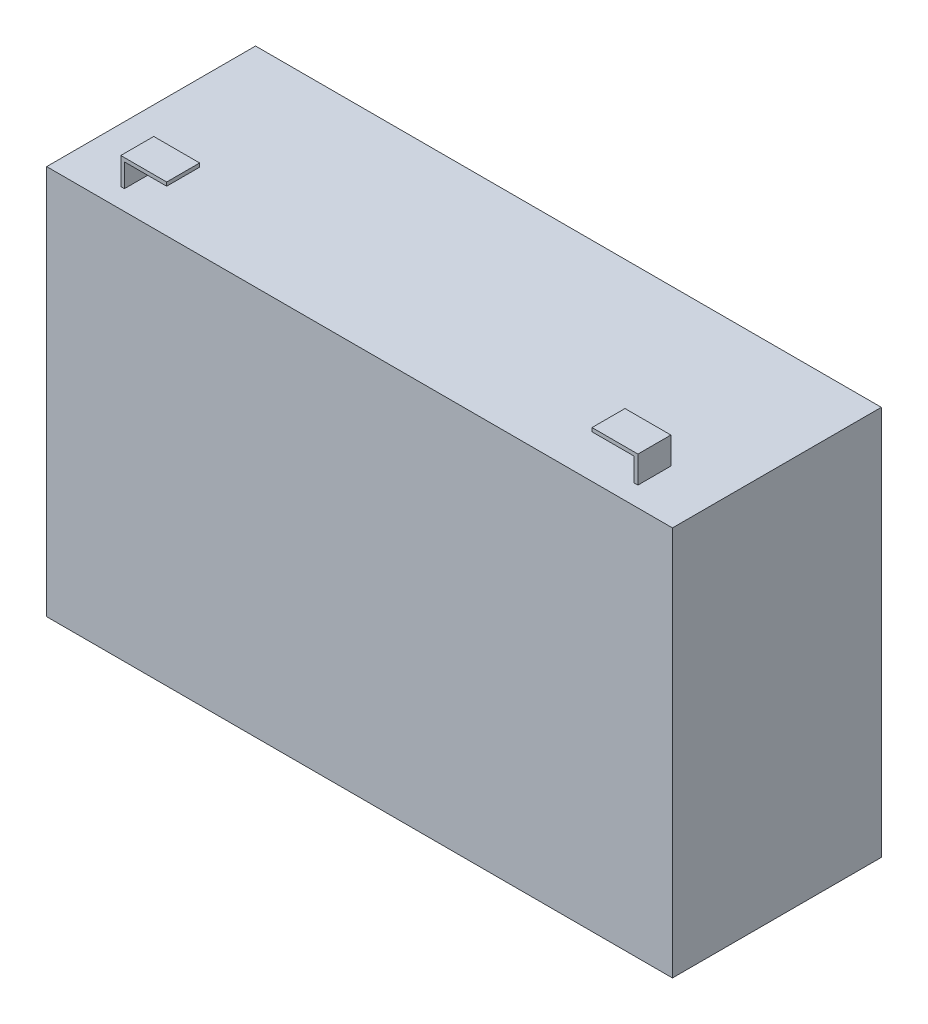
ISO-10303-21;
HEADER;
FILE_DESCRIPTION(('STEP AP214'),'2;1');
FILE_NAME('part.step','',(''),(''),'','','');
FILE_SCHEMA(('AUTOMOTIVE_DESIGN { 1 0 10303 214 1 1 1 1 }'));
ENDSEC;
DATA;
#1=APPLICATION_CONTEXT('core data for automotive mechanical design processes');
#2=APPLICATION_PROTOCOL_DEFINITION('international standard','automotive_design',2000,#1);
#3=PRODUCT_CONTEXT('',#1,'mechanical');
#4=PRODUCT('Part','Part','',(#3));
#5=PRODUCT_RELATED_PRODUCT_CATEGORY('part','',(#4));
#6=PRODUCT_DEFINITION_FORMATION('','',#4);
#7=PRODUCT_DEFINITION_CONTEXT('part definition',#1,'design');
#8=PRODUCT_DEFINITION('design','',#6,#7);
#9=PRODUCT_DEFINITION_SHAPE('','',#8);
#10=(LENGTH_UNIT() NAMED_UNIT(*) SI_UNIT(.MILLI.,.METRE.));
#11=(NAMED_UNIT(*) PLANE_ANGLE_UNIT() SI_UNIT($,.RADIAN.));
#12=(NAMED_UNIT(*) SI_UNIT($,.STERADIAN.) SOLID_ANGLE_UNIT());
#13=UNCERTAINTY_MEASURE_WITH_UNIT(LENGTH_MEASURE(1.E-05),#10,'distance_accuracy_value','');
#14=(GEOMETRIC_REPRESENTATION_CONTEXT(3) GLOBAL_UNCERTAINTY_ASSIGNED_CONTEXT((#13)) GLOBAL_UNIT_ASSIGNED_CONTEXT((#10,
#11,#12)) REPRESENTATION_CONTEXT('',''));
#15=CARTESIAN_POINT('',(0.,0.,0.));
#16=DIRECTION('',(0.,0.,1.));
#17=DIRECTION('',(1.,0.,0.));
#18=AXIS2_PLACEMENT_3D('',#15,#16,#17);
#19=CARTESIAN_POINT('',(136.7028,100.33,45.5295));
#20=DIRECTION('',(1.,0.,0.));
#21=DIRECTION('',(0.,1.,0.));
#22=AXIS2_PLACEMENT_3D('',#19,#20,#21);
#23=PLANE('',#22);
#24=DIRECTION('',(0.,0.,1.));
#25=VECTOR('',#24,1.);
#26=CARTESIAN_POINT('',(136.7028,99.4410000000001,45.5295));
#27=LINE('',#26,#25);
#28=CARTESIAN_POINT('',(136.7028,99.441,37.592));
#29=VERTEX_POINT('',#28);
#30=CARTESIAN_POINT('',(136.7028,99.4410000000001,45.5295));
#31=VERTEX_POINT('',#30);
#32=EDGE_CURVE('E174',#29,#31,#27,.T.);
#33=ORIENTED_EDGE('',*,*,#32,.F.);
#34=DIRECTION('',(0.,-1.,0.));
#35=VECTOR('',#34,1.);
#36=CARTESIAN_POINT('',(136.7028,100.33,37.592));
#37=LINE('',#36,#35);
#38=CARTESIAN_POINT('',(136.7028,93.853,37.592));
#39=VERTEX_POINT('',#38);
#40=EDGE_CURVE('E58',#29,#39,#37,.T.);
#41=ORIENTED_EDGE('',*,*,#40,.T.);
#42=DIRECTION('',(0.,0.,1.));
#43=VECTOR('',#42,1.);
#44=CARTESIAN_POINT('',(136.7028,93.8530000000001,45.5295));
#45=LINE('',#44,#43);
#46=CARTESIAN_POINT('',(136.7028,93.853,45.5295));
#47=VERTEX_POINT('',#46);
#48=EDGE_CURVE('E211',#39,#47,#45,.T.);
#49=ORIENTED_EDGE('',*,*,#48,.T.);
#50=DIRECTION('',(0.,-1.,0.));
#51=VECTOR('',#50,1.);
#52=CARTESIAN_POINT('',(136.7028,100.33,45.5295));
#53=LINE('',#52,#51);
#54=EDGE_CURVE('E216',#31,#47,#53,.T.);
#55=ORIENTED_EDGE('',*,*,#54,.F.);
#56=EDGE_LOOP('',(#33,#41,#49,#55));
#57=FACE_BOUND('',#56,.T.);
#58=ADVANCED_FACE('F35',(#57),#23,.F.);
#59=CARTESIAN_POINT('',(0.,93.853,50.292));
#60=DIRECTION('',(0.,-1.,0.));
#61=DIRECTION('',(0.,0.,-1.));
#62=AXIS2_PLACEMENT_3D('',#59,#60,#61);
#63=PLANE('',#62);
#64=DIRECTION('',(0.,0.,1.));
#65=VECTOR('',#64,1.);
#66=CARTESIAN_POINT('',(13.081,93.8530000000001,37.592));
#67=LINE('',#66,#65);
#68=CARTESIAN_POINT('',(13.081,93.8530000000001,37.592));
#69=VERTEX_POINT('',#68);
#70=CARTESIAN_POINT('',(13.081,93.853,45.5295));
#71=VERTEX_POINT('',#70);
#72=EDGE_CURVE('E220',#69,#71,#67,.T.);
#73=ORIENTED_EDGE('',*,*,#72,.F.);
#74=DIRECTION('',(-1.,0.,0.));
#75=VECTOR('',#74,1.);
#76=CARTESIAN_POINT('',(13.081,93.8530000000001,37.592));
#77=LINE('',#76,#75);
#78=CARTESIAN_POINT('',(13.97,93.853,37.592));
#79=VERTEX_POINT('',#78);
#80=EDGE_CURVE('E225',#79,#69,#77,.T.);
#81=ORIENTED_EDGE('',*,*,#80,.F.);
#82=DIRECTION('',(0.,0.,-1.));
#83=VECTOR('',#82,1.);
#84=CARTESIAN_POINT('',(13.97,93.8530000000001,37.592));
#85=LINE('',#84,#83);
#86=CARTESIAN_POINT('',(13.97,93.853,45.5295));
#87=VERTEX_POINT('',#86);
#88=EDGE_CURVE('E235',#87,#79,#85,.T.);
#89=ORIENTED_EDGE('',*,*,#88,.F.);
#90=DIRECTION('',(1.,0.,0.));
#91=VECTOR('',#90,1.);
#92=CARTESIAN_POINT('',(13.081,93.8530000000001,45.5295));
#93=LINE('',#92,#91);
#94=EDGE_CURVE('E232',#71,#87,#93,.T.);
#95=ORIENTED_EDGE('',*,*,#94,.F.);
#96=EDGE_LOOP('',(#73,#81,#89,#95));
#97=FACE_BOUND('',#96,.T.);
#98=DIRECTION('',(-1.,0.,0.));
#99=VECTOR('',#98,1.);
#100=CARTESIAN_POINT('',(0.,93.853,0.));
#101=LINE('',#100,#99);
#102=CARTESIAN_POINT('',(150.6728,93.853,0.));
#103=VERTEX_POINT('',#102);
#104=CARTESIAN_POINT('',(0.,93.853,0.));
#105=VERTEX_POINT('',#104);
#106=EDGE_CURVE('E252',#103,#105,#101,.T.);
#107=ORIENTED_EDGE('',*,*,#106,.T.);
#108=DIRECTION('',(0.,0.,-1.));
#109=VECTOR('',#108,1.);
#110=CARTESIAN_POINT('',(0.,93.853,50.292));
#111=LINE('',#110,#109);
#112=CARTESIAN_POINT('',(0.,93.853,50.292));
#113=VERTEX_POINT('',#112);
#114=EDGE_CURVE('E258',#113,#105,#111,.T.);
#115=ORIENTED_EDGE('',*,*,#114,.F.);
#116=DIRECTION('',(-1.,0.,0.));
#117=VECTOR('',#116,1.);
#118=CARTESIAN_POINT('',(0.,93.853,50.292));
#119=LINE('',#118,#117);
#120=CARTESIAN_POINT('',(150.6728,93.853,50.292));
#121=VERTEX_POINT('',#120);
#122=EDGE_CURVE('E256',#121,#113,#119,.T.);
#123=ORIENTED_EDGE('',*,*,#122,.F.);
#124=DIRECTION('',(0.,0.,-1.));
#125=VECTOR('',#124,1.);
#126=CARTESIAN_POINT('',(150.6728,93.853,50.292));
#127=LINE('',#126,#125);
#128=EDGE_CURVE('E268',#121,#103,#127,.T.);
#129=ORIENTED_EDGE('',*,*,#128,.T.);
#130=EDGE_LOOP('',(#107,#115,#123,#129));
#131=FACE_BOUND('',#130,.T.);
#132=DIRECTION('',(0.,0.,-1.));
#133=VECTOR('',#132,1.);
#134=CARTESIAN_POINT('',(137.5918,93.8530000000001,45.5295));
#135=LINE('',#134,#133);
#136=CARTESIAN_POINT('',(137.5918,93.8530000000001,45.5295));
#137=VERTEX_POINT('',#136);
#138=CARTESIAN_POINT('',(137.5918,93.853,37.592));
#139=VERTEX_POINT('',#138);
#140=EDGE_CURVE('E197',#137,#139,#135,.T.);
#141=ORIENTED_EDGE('',*,*,#140,.F.);
#142=DIRECTION('',(1.,0.,0.));
#143=VECTOR('',#142,1.);
#144=CARTESIAN_POINT('',(137.5918,93.8530000000001,45.5295));
#145=LINE('',#144,#143);
#146=EDGE_CURVE('E202',#47,#137,#145,.T.);
#147=ORIENTED_EDGE('',*,*,#146,.F.);
#148=ORIENTED_EDGE('',*,*,#48,.F.);
#149=DIRECTION('',(-1.,0.,0.));
#150=VECTOR('',#149,1.);
#151=CARTESIAN_POINT('',(137.5918,93.8530000000001,37.592));
#152=LINE('',#151,#150);
#153=EDGE_CURVE('E209',#139,#39,#152,.T.);
#154=ORIENTED_EDGE('',*,*,#153,.F.);
#155=EDGE_LOOP('',(#141,#147,#148,#154));
#156=FACE_BOUND('',#155,.T.);
#157=ADVANCED_FACE('F284',(#97,#131,#156),#63,.F.);
#158=CARTESIAN_POINT('',(0.,0.,50.292));
#159=DIRECTION('',(1.,0.,0.));
#160=DIRECTION('',(0.,0.,-1.));
#161=AXIS2_PLACEMENT_3D('',#158,#159,#160);
#162=PLANE('',#161);
#163=DIRECTION('',(0.,-1.,0.));
#164=VECTOR('',#163,1.);
#165=CARTESIAN_POINT('',(0.,0.,0.));
#166=LINE('',#165,#164);
#167=CARTESIAN_POINT('',(0.,0.,0.));
#168=VERTEX_POINT('',#167);
#169=EDGE_CURVE('E247',#105,#168,#166,.T.);
#170=ORIENTED_EDGE('',*,*,#169,.T.);
#171=DIRECTION('',(0.,0.,-1.));
#172=VECTOR('',#171,1.);
#173=CARTESIAN_POINT('',(0.,0.,50.292));
#174=LINE('',#173,#172);
#175=CARTESIAN_POINT('',(0.,0.,50.292));
#176=VERTEX_POINT('',#175);
#177=EDGE_CURVE('E11',#176,#168,#174,.T.);
#178=ORIENTED_EDGE('',*,*,#177,.F.);
#179=DIRECTION('',(0.,-1.,0.));
#180=VECTOR('',#179,1.);
#181=CARTESIAN_POINT('',(0.,0.,50.292));
#182=LINE('',#181,#180);
#183=EDGE_CURVE('E248',#113,#176,#182,.T.);
#184=ORIENTED_EDGE('',*,*,#183,.F.);
#185=ORIENTED_EDGE('',*,*,#114,.T.);
#186=EDGE_LOOP('',(#170,#178,#184,#185));
#187=FACE_BOUND('',#186,.T.);
#188=ADVANCED_FACE('F37',(#187),#162,.F.);
#189=CARTESIAN_POINT('',(0.,0.,50.292));
#190=DIRECTION('',(0.,1.,0.));
#191=DIRECTION('',(0.,0.,1.));
#192=AXIS2_PLACEMENT_3D('',#189,#190,#191);
#193=PLANE('',#192);
#194=DIRECTION('',(1.,0.,0.));
#195=VECTOR('',#194,1.);
#196=CARTESIAN_POINT('',(0.,0.,0.));
#197=LINE('',#196,#195);
#198=CARTESIAN_POINT('',(150.6728,0.,0.));
#199=VERTEX_POINT('',#198);
#200=EDGE_CURVE('E261',#168,#199,#197,.T.);
#201=ORIENTED_EDGE('',*,*,#200,.T.);
#202=DIRECTION('',(0.,0.,-1.));
#203=VECTOR('',#202,1.);
#204=CARTESIAN_POINT('',(150.6728,0.,50.292));
#205=LINE('',#204,#203);
#206=CARTESIAN_POINT('',(150.6728,0.,50.292));
#207=VERTEX_POINT('',#206);
#208=EDGE_CURVE('E43',#207,#199,#205,.T.);
#209=ORIENTED_EDGE('',*,*,#208,.F.);
#210=DIRECTION('',(1.,0.,0.));
#211=VECTOR('',#210,1.);
#212=CARTESIAN_POINT('',(0.,0.,50.292));
#213=LINE('',#212,#211);
#214=EDGE_CURVE('E251',#176,#207,#213,.T.);
#215=ORIENTED_EDGE('',*,*,#214,.F.);
#216=ORIENTED_EDGE('',*,*,#177,.T.);
#217=EDGE_LOOP('',(#201,#209,#215,#216));
#218=FACE_BOUND('',#217,.T.);
#219=ADVANCED_FACE('F292',(#218),#193,.F.);
#220=CARTESIAN_POINT('',(150.6728,0.,50.292));
#221=DIRECTION('',(-1.,0.,0.));
#222=DIRECTION('',(0.,0.,1.));
#223=AXIS2_PLACEMENT_3D('',#220,#221,#222);
#224=PLANE('',#223);
#225=DIRECTION('',(0.,1.,0.));
#226=VECTOR('',#225,1.);
#227=CARTESIAN_POINT('',(150.6728,0.,0.));
#228=LINE('',#227,#226);
#229=EDGE_CURVE('E263',#199,#103,#228,.T.);
#230=ORIENTED_EDGE('',*,*,#229,.T.);
#231=ORIENTED_EDGE('',*,*,#128,.F.);
#232=DIRECTION('',(0.,1.,0.));
#233=VECTOR('',#232,1.);
#234=CARTESIAN_POINT('',(150.6728,0.,50.292));
#235=LINE('',#234,#233);
#236=EDGE_CURVE('E254',#207,#121,#235,.T.);
#237=ORIENTED_EDGE('',*,*,#236,.F.);
#238=ORIENTED_EDGE('',*,*,#208,.T.);
#239=EDGE_LOOP('',(#230,#231,#237,#238));
#240=FACE_BOUND('',#239,.T.);
#241=ADVANCED_FACE('F275',(#240),#224,.F.);
#242=CARTESIAN_POINT('',(0.,93.853,50.292));
#243=DIRECTION('',(0.,0.,-1.));
#244=DIRECTION('',(-1.,0.,0.));
#245=AXIS2_PLACEMENT_3D('',#242,#243,#244);
#246=PLANE('',#245);
#247=ORIENTED_EDGE('',*,*,#183,.T.);
#248=ORIENTED_EDGE('',*,*,#214,.T.);
#249=ORIENTED_EDGE('',*,*,#236,.T.);
#250=ORIENTED_EDGE('',*,*,#122,.T.);
#251=EDGE_LOOP('',(#247,#248,#249,#250));
#252=FACE_BOUND('',#251,.T.);
#253=ADVANCED_FACE('F291',(#252),#246,.F.);
#254=CARTESIAN_POINT('',(0.,93.853,0.));
#255=DIRECTION('',(0.,0.,-1.));
#256=DIRECTION('',(-1.,0.,0.));
#257=AXIS2_PLACEMENT_3D('',#254,#255,#256);
#258=PLANE('',#257);
#259=ORIENTED_EDGE('',*,*,#169,.F.);
#260=ORIENTED_EDGE('',*,*,#106,.F.);
#261=ORIENTED_EDGE('',*,*,#229,.F.);
#262=ORIENTED_EDGE('',*,*,#200,.F.);
#263=EDGE_LOOP('',(#259,#260,#261,#262));
#264=FACE_BOUND('',#263,.T.);
#265=ADVANCED_FACE('F281',(#264),#258,.T.);
#266=CARTESIAN_POINT('',(13.081,100.33,37.592));
#267=DIRECTION('',(1.,0.,0.));
#268=DIRECTION('',(0.,0.,-1.));
#269=AXIS2_PLACEMENT_3D('',#266,#267,#268);
#270=PLANE('',#269);
#271=ORIENTED_EDGE('',*,*,#72,.T.);
#272=DIRECTION('',(0.,-1.,0.));
#273=VECTOR('',#272,1.);
#274=CARTESIAN_POINT('',(13.081,100.33,45.5295));
#275=LINE('',#274,#273);
#276=CARTESIAN_POINT('',(13.081,100.33,45.5295));
#277=VERTEX_POINT('',#276);
#278=EDGE_CURVE('E245',#277,#71,#275,.T.);
#279=ORIENTED_EDGE('',*,*,#278,.F.);
#280=DIRECTION('',(0.,0.,1.));
#281=VECTOR('',#280,1.);
#282=CARTESIAN_POINT('',(13.081,100.33,37.592));
#283=LINE('',#282,#281);
#284=CARTESIAN_POINT('',(13.081,100.33,37.592));
#285=VERTEX_POINT('',#284);
#286=EDGE_CURVE('E221',#285,#277,#283,.T.);
#287=ORIENTED_EDGE('',*,*,#286,.F.);
#288=DIRECTION('',(0.,-1.,0.));
#289=VECTOR('',#288,1.);
#290=CARTESIAN_POINT('',(13.081,100.33,37.592));
#291=LINE('',#290,#289);
#292=EDGE_CURVE('E229',#285,#69,#291,.T.);
#293=ORIENTED_EDGE('',*,*,#292,.T.);
#294=EDGE_LOOP('',(#271,#279,#287,#293));
#295=FACE_BOUND('',#294,.T.);
#296=ADVANCED_FACE('F331',(#295),#270,.F.);
#297=CARTESIAN_POINT('',(13.081,100.33,45.5295));
#298=DIRECTION('',(0.,0.,-1.));
#299=DIRECTION('',(0.,1.,0.));
#300=AXIS2_PLACEMENT_3D('',#297,#298,#299);
#301=PLANE('',#300);
#302=DIRECTION('',(0.,-1.,0.));
#303=VECTOR('',#302,1.);
#304=CARTESIAN_POINT('',(13.97,100.33,45.5295));
#305=LINE('',#304,#303);
#306=CARTESIAN_POINT('',(13.97,99.4410000000001,45.5295));
#307=VERTEX_POINT('',#306);
#308=EDGE_CURVE('E243',#307,#87,#305,.T.);
#309=ORIENTED_EDGE('',*,*,#308,.F.);
#310=DIRECTION('',(1.,0.,0.));
#311=VECTOR('',#310,1.);
#312=CARTESIAN_POINT('',(13.081,99.4410000000001,45.5295));
#313=LINE('',#312,#311);
#314=CARTESIAN_POINT('',(24.13,99.4410000000001,45.5295));
#315=VERTEX_POINT('',#314);
#316=EDGE_CURVE('E178',#307,#315,#313,.T.);
#317=ORIENTED_EDGE('',*,*,#316,.T.);
#318=DIRECTION('',(0.,1.,0.));
#319=VECTOR('',#318,1.);
#320=CARTESIAN_POINT('',(24.13,99.4410000000001,45.5295));
#321=LINE('',#320,#319);
#322=CARTESIAN_POINT('',(24.13,100.33,45.5295));
#323=VERTEX_POINT('',#322);
#324=EDGE_CURVE('E186',#315,#323,#321,.T.);
#325=ORIENTED_EDGE('',*,*,#324,.T.);
#326=DIRECTION('',(1.,0.,0.));
#327=VECTOR('',#326,1.);
#328=CARTESIAN_POINT('',(13.081,100.33,45.5295));
#329=LINE('',#328,#327);
#330=EDGE_CURVE('E224',#277,#323,#329,.T.);
#331=ORIENTED_EDGE('',*,*,#330,.F.);
#332=ORIENTED_EDGE('',*,*,#278,.T.);
#333=ORIENTED_EDGE('',*,*,#94,.T.);
#334=EDGE_LOOP('',(#309,#317,#325,#331,#332,#333));
#335=FACE_BOUND('',#334,.T.);
#336=ADVANCED_FACE('F327',(#335),#301,.F.);
#337=CARTESIAN_POINT('',(13.97,100.33,37.592));
#338=DIRECTION('',(-1.,0.,0.));
#339=DIRECTION('',(0.,-1.,0.));
#340=AXIS2_PLACEMENT_3D('',#337,#338,#339);
#341=PLANE('',#340);
#342=DIRECTION('',(0.,-1.,0.));
#343=VECTOR('',#342,1.);
#344=CARTESIAN_POINT('',(13.97,100.33,37.592));
#345=LINE('',#344,#343);
#346=CARTESIAN_POINT('',(13.97,99.441,37.592));
#347=VERTEX_POINT('',#346);
#348=EDGE_CURVE('E241',#347,#79,#345,.T.);
#349=ORIENTED_EDGE('',*,*,#348,.F.);
#350=DIRECTION('',(0.,0.,1.));
#351=VECTOR('',#350,1.);
#352=CARTESIAN_POINT('',(13.97,99.441,37.592));
#353=LINE('',#352,#351);
#354=EDGE_CURVE('E192',#347,#307,#353,.T.);
#355=ORIENTED_EDGE('',*,*,#354,.T.);
#356=ORIENTED_EDGE('',*,*,#308,.T.);
#357=ORIENTED_EDGE('',*,*,#88,.T.);
#358=EDGE_LOOP('',(#349,#355,#356,#357));
#359=FACE_BOUND('',#358,.T.);
#360=ADVANCED_FACE('F323',(#359),#341,.F.);
#361=CARTESIAN_POINT('',(13.081,100.33,37.592));
#362=DIRECTION('',(0.,0.,1.));
#363=DIRECTION('',(0.,-1.,0.));
#364=AXIS2_PLACEMENT_3D('',#361,#362,#363);
#365=PLANE('',#364);
#366=ORIENTED_EDGE('',*,*,#80,.T.);
#367=ORIENTED_EDGE('',*,*,#292,.F.);
#368=DIRECTION('',(-1.,0.,0.));
#369=VECTOR('',#368,1.);
#370=CARTESIAN_POINT('',(13.081,100.33,37.592));
#371=LINE('',#370,#369);
#372=CARTESIAN_POINT('',(24.13,100.33,37.592));
#373=VERTEX_POINT('',#372);
#374=EDGE_CURVE('E227',#373,#285,#371,.T.);
#375=ORIENTED_EDGE('',*,*,#374,.F.);
#376=DIRECTION('',(0.,1.,0.));
#377=VECTOR('',#376,1.);
#378=CARTESIAN_POINT('',(24.13,99.441,37.592));
#379=LINE('',#378,#377);
#380=CARTESIAN_POINT('',(24.13,99.441,37.592));
#381=VERTEX_POINT('',#380);
#382=EDGE_CURVE('E189',#381,#373,#379,.T.);
#383=ORIENTED_EDGE('',*,*,#382,.F.);
#384=DIRECTION('',(-1.,0.,0.));
#385=VECTOR('',#384,1.);
#386=CARTESIAN_POINT('',(13.081,99.441,37.592));
#387=LINE('',#386,#385);
#388=EDGE_CURVE('E183',#381,#347,#387,.T.);
#389=ORIENTED_EDGE('',*,*,#388,.T.);
#390=ORIENTED_EDGE('',*,*,#348,.T.);
#391=EDGE_LOOP('',(#366,#367,#375,#383,#389,#390));
#392=FACE_BOUND('',#391,.T.);
#393=ADVANCED_FACE('F319',(#392),#365,.F.);
#394=CARTESIAN_POINT('',(13.081,100.33,45.5295));
#395=DIRECTION('',(0.,1.,0.));
#396=DIRECTION('',(0.,0.,1.));
#397=AXIS2_PLACEMENT_3D('',#394,#395,#396);
#398=PLANE('',#397);
#399=ORIENTED_EDGE('',*,*,#286,.T.);
#400=ORIENTED_EDGE('',*,*,#330,.T.);
#401=DIRECTION('',(0.,0.,-1.));
#402=VECTOR('',#401,1.);
#403=CARTESIAN_POINT('',(24.13,100.33,45.5295));
#404=LINE('',#403,#402);
#405=EDGE_CURVE('E177',#323,#373,#404,.T.);
#406=ORIENTED_EDGE('',*,*,#405,.T.);
#407=ORIENTED_EDGE('',*,*,#374,.T.);
#408=EDGE_LOOP('',(#399,#400,#406,#407));
#409=FACE_BOUND('',#408,.T.);
#410=ADVANCED_FACE('F315',(#409),#398,.T.);
#411=CARTESIAN_POINT('',(137.5918,100.33,45.5295));
#412=DIRECTION('',(-1.,0.,0.));
#413=DIRECTION('',(0.,-1.,0.));
#414=AXIS2_PLACEMENT_3D('',#411,#412,#413);
#415=PLANE('',#414);
#416=DIRECTION('',(0.,-1.,0.));
#417=VECTOR('',#416,1.);
#418=CARTESIAN_POINT('',(137.5918,100.33,45.5295));
#419=LINE('',#418,#417);
#420=CARTESIAN_POINT('',(137.5918,100.33,45.5295));
#421=VERTEX_POINT('',#420);
#422=EDGE_CURVE('E206',#421,#137,#419,.T.);
#423=ORIENTED_EDGE('',*,*,#422,.T.);
#424=ORIENTED_EDGE('',*,*,#140,.T.);
#425=DIRECTION('',(0.,-1.,0.));
#426=VECTOR('',#425,1.);
#427=CARTESIAN_POINT('',(137.5918,100.33,37.592));
#428=LINE('',#427,#426);
#429=CARTESIAN_POINT('',(137.5918,100.33,37.592));
#430=VERTEX_POINT('',#429);
#431=EDGE_CURVE('E50',#430,#139,#428,.T.);
#432=ORIENTED_EDGE('',*,*,#431,.F.);
#433=DIRECTION('',(0.,0.,-1.));
#434=VECTOR('',#433,1.);
#435=CARTESIAN_POINT('',(137.5918,100.33,45.5295));
#436=LINE('',#435,#434);
#437=EDGE_CURVE('E198',#421,#430,#436,.T.);
#438=ORIENTED_EDGE('',*,*,#437,.F.);
#439=EDGE_LOOP('',(#423,#424,#432,#438));
#440=FACE_BOUND('',#439,.T.);
#441=ADVANCED_FACE('F312',(#440),#415,.F.);
#442=CARTESIAN_POINT('',(137.5918,100.33,37.592));
#443=DIRECTION('',(0.,0.,1.));
#444=DIRECTION('',(0.,-1.,0.));
#445=AXIS2_PLACEMENT_3D('',#442,#443,#444);
#446=PLANE('',#445);
#447=ORIENTED_EDGE('',*,*,#431,.T.);
#448=ORIENTED_EDGE('',*,*,#153,.T.);
#449=ORIENTED_EDGE('',*,*,#40,.F.);
#450=DIRECTION('',(-1.,0.,0.));
#451=VECTOR('',#450,1.);
#452=CARTESIAN_POINT('',(137.5918,99.441,37.592));
#453=LINE('',#452,#451);
#454=CARTESIAN_POINT('',(126.5428,99.441,37.592));
#455=VERTEX_POINT('',#454);
#456=EDGE_CURVE('E149',#29,#455,#453,.T.);
#457=ORIENTED_EDGE('',*,*,#456,.T.);
#458=DIRECTION('',(0.,1.,0.));
#459=VECTOR('',#458,1.);
#460=CARTESIAN_POINT('',(126.5428,99.441,37.592));
#461=LINE('',#460,#459);
#462=CARTESIAN_POINT('',(126.5428,100.33,37.592));
#463=VERTEX_POINT('',#462);
#464=EDGE_CURVE('E152',#455,#463,#461,.T.);
#465=ORIENTED_EDGE('',*,*,#464,.T.);
#466=DIRECTION('',(-1.,0.,0.));
#467=VECTOR('',#466,1.);
#468=CARTESIAN_POINT('',(137.5918,100.33,37.592));
#469=LINE('',#468,#467);
#470=EDGE_CURVE('E201',#430,#463,#469,.T.);
#471=ORIENTED_EDGE('',*,*,#470,.F.);
#472=EDGE_LOOP('',(#447,#448,#449,#457,#465,#471));
#473=FACE_BOUND('',#472,.T.);
#474=ADVANCED_FACE('F151',(#473),#446,.F.);
#475=CARTESIAN_POINT('',(137.5918,100.33,45.5295));
#476=DIRECTION('',(0.,0.,-1.));
#477=DIRECTION('',(0.,1.,0.));
#478=AXIS2_PLACEMENT_3D('',#475,#476,#477);
#479=PLANE('',#478);
#480=DIRECTION('',(1.,0.,0.));
#481=VECTOR('',#480,1.);
#482=CARTESIAN_POINT('',(137.5918,100.33,45.5295));
#483=LINE('',#482,#481);
#484=CARTESIAN_POINT('',(126.5428,100.33,45.5295));
#485=VERTEX_POINT('',#484);
#486=EDGE_CURVE('E204',#485,#421,#483,.T.);
#487=ORIENTED_EDGE('',*,*,#486,.F.);
#488=DIRECTION('',(0.,1.,0.));
#489=VECTOR('',#488,1.);
#490=CARTESIAN_POINT('',(126.5428,99.4410000000001,45.5295));
#491=LINE('',#490,#489);
#492=CARTESIAN_POINT('',(126.5428,99.4410000000001,45.5295));
#493=VERTEX_POINT('',#492);
#494=EDGE_CURVE('E165',#493,#485,#491,.T.);
#495=ORIENTED_EDGE('',*,*,#494,.F.);
#496=DIRECTION('',(1.,0.,0.));
#497=VECTOR('',#496,1.);
#498=CARTESIAN_POINT('',(137.5918,99.4410000000001,45.5295));
#499=LINE('',#498,#497);
#500=EDGE_CURVE('E166',#493,#31,#499,.T.);
#501=ORIENTED_EDGE('',*,*,#500,.T.);
#502=ORIENTED_EDGE('',*,*,#54,.T.);
#503=ORIENTED_EDGE('',*,*,#146,.T.);
#504=ORIENTED_EDGE('',*,*,#422,.F.);
#505=EDGE_LOOP('',(#487,#495,#501,#502,#503,#504));
#506=FACE_BOUND('',#505,.T.);
#507=ADVANCED_FACE('F308',(#506),#479,.F.);
#508=CARTESIAN_POINT('',(137.5918,100.33,37.592));
#509=DIRECTION('',(0.,1.,0.));
#510=DIRECTION('',(0.,0.,1.));
#511=AXIS2_PLACEMENT_3D('',#508,#509,#510);
#512=PLANE('',#511);
#513=ORIENTED_EDGE('',*,*,#437,.T.);
#514=ORIENTED_EDGE('',*,*,#470,.T.);
#515=DIRECTION('',(0.,0.,1.));
#516=VECTOR('',#515,1.);
#517=CARTESIAN_POINT('',(126.5428,100.33,45.5295));
#518=LINE('',#517,#516);
#519=EDGE_CURVE('E157',#463,#485,#518,.T.);
#520=ORIENTED_EDGE('',*,*,#519,.T.);
#521=ORIENTED_EDGE('',*,*,#486,.T.);
#522=EDGE_LOOP('',(#513,#514,#520,#521));
#523=FACE_BOUND('',#522,.T.);
#524=ADVANCED_FACE('F378',(#523),#512,.T.);
#525=CARTESIAN_POINT('',(13.081,99.441,37.592));
#526=DIRECTION('',(0.,-1.,0.));
#527=DIRECTION('',(0.,0.,-1.));
#528=AXIS2_PLACEMENT_3D('',#525,#526,#527);
#529=PLANE('',#528);
#530=ORIENTED_EDGE('',*,*,#354,.F.);
#531=ORIENTED_EDGE('',*,*,#388,.F.);
#532=DIRECTION('',(0.,0.,-1.));
#533=VECTOR('',#532,1.);
#534=CARTESIAN_POINT('',(24.13,99.4410000000001,45.5295));
#535=LINE('',#534,#533);
#536=EDGE_CURVE('E180',#315,#381,#535,.T.);
#537=ORIENTED_EDGE('',*,*,#536,.F.);
#538=ORIENTED_EDGE('',*,*,#316,.F.);
#539=EDGE_LOOP('',(#530,#531,#537,#538));
#540=FACE_BOUND('',#539,.T.);
#541=ADVANCED_FACE('F385',(#540),#529,.T.);
#542=CARTESIAN_POINT('',(24.13,99.4410000000001,45.5295));
#543=DIRECTION('',(1.,0.,0.));
#544=DIRECTION('',(0.,0.,-1.));
#545=AXIS2_PLACEMENT_3D('',#542,#543,#544);
#546=PLANE('',#545);
#547=ORIENTED_EDGE('',*,*,#405,.F.);
#548=ORIENTED_EDGE('',*,*,#324,.F.);
#549=ORIENTED_EDGE('',*,*,#536,.T.);
#550=ORIENTED_EDGE('',*,*,#382,.T.);
#551=EDGE_LOOP('',(#547,#548,#549,#550));
#552=FACE_BOUND('',#551,.T.);
#553=ADVANCED_FACE('F392',(#552),#546,.T.);
#554=CARTESIAN_POINT('',(137.5918,99.441,37.592));
#555=DIRECTION('',(0.,1.,0.));
#556=DIRECTION('',(0.,0.,1.));
#557=AXIS2_PLACEMENT_3D('',#554,#555,#556);
#558=PLANE('',#557);
#559=ORIENTED_EDGE('',*,*,#456,.F.);
#560=ORIENTED_EDGE('',*,*,#32,.T.);
#561=ORIENTED_EDGE('',*,*,#500,.F.);
#562=DIRECTION('',(0.,0.,1.));
#563=VECTOR('',#562,1.);
#564=CARTESIAN_POINT('',(126.5428,99.4410000000001,45.5295));
#565=LINE('',#564,#563);
#566=EDGE_CURVE('E156',#455,#493,#565,.T.);
#567=ORIENTED_EDGE('',*,*,#566,.F.);
#568=EDGE_LOOP('',(#559,#560,#561,#567));
#569=FACE_BOUND('',#568,.T.);
#570=ADVANCED_FACE('F168',(#569),#558,.F.);
#571=CARTESIAN_POINT('',(126.5428,99.4410000000001,45.5295));
#572=DIRECTION('',(-1.,0.,0.));
#573=DIRECTION('',(0.,0.,1.));
#574=AXIS2_PLACEMENT_3D('',#571,#572,#573);
#575=PLANE('',#574);
#576=ORIENTED_EDGE('',*,*,#519,.F.);
#577=ORIENTED_EDGE('',*,*,#464,.F.);
#578=ORIENTED_EDGE('',*,*,#566,.T.);
#579=ORIENTED_EDGE('',*,*,#494,.T.);
#580=EDGE_LOOP('',(#576,#577,#578,#579));
#581=FACE_BOUND('',#580,.T.);
#582=ADVANCED_FACE('F161',(#581),#575,.T.);
#583=CLOSED_SHELL('',(#58,#157,#188,#219,#241,#253,#265,#296,#336,#360,#393,#410,#441,#474,#507,
#524,#541,#553,#570,#582));
#584=MANIFOLD_SOLID_BREP('B2',#583);
#585=ADVANCED_BREP_SHAPE_REPRESENTATION('',(#18,#584),#14);
#586=SHAPE_DEFINITION_REPRESENTATION(#9,#585);
ENDSEC;
END-ISO-10303-21;
